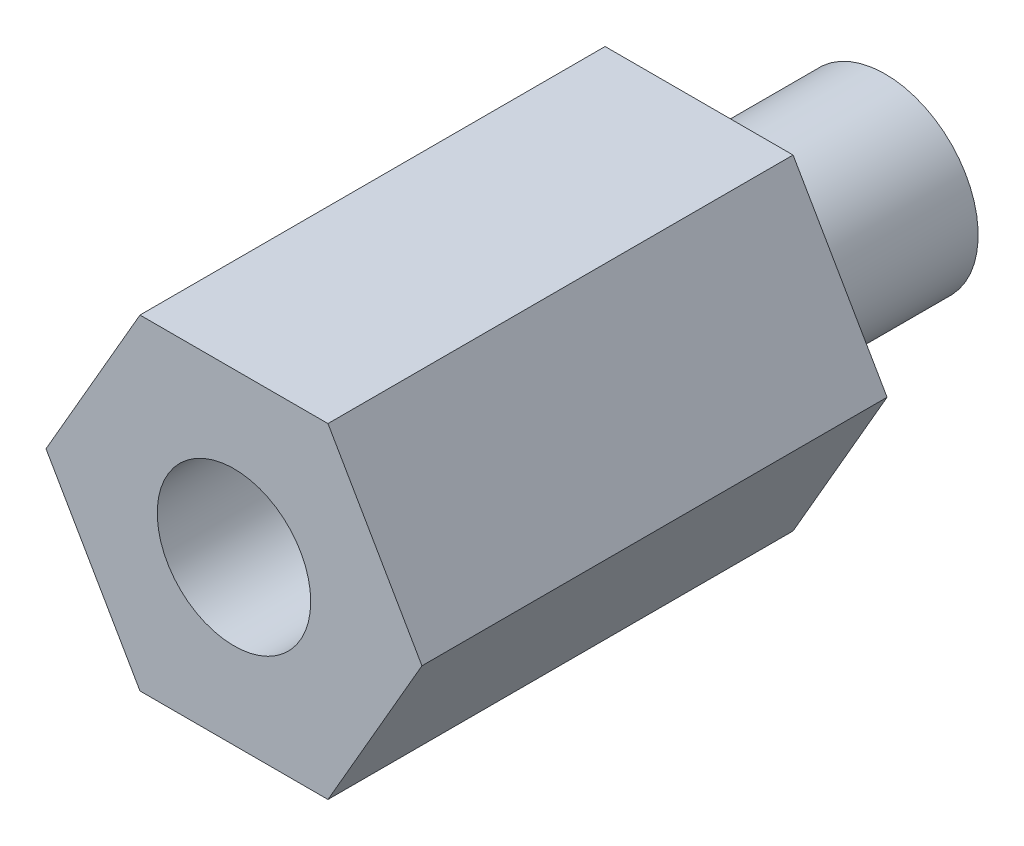
ISO-10303-21;
HEADER;
FILE_DESCRIPTION(('STEP AP214'),'2;1');
FILE_NAME('part.step','',(''),(''),'','','');
FILE_SCHEMA(('AUTOMOTIVE_DESIGN { 1 0 10303 214 1 1 1 1 }'));
ENDSEC;
DATA;
#1=APPLICATION_CONTEXT('core data for automotive mechanical design processes');
#2=APPLICATION_PROTOCOL_DEFINITION('international standard','automotive_design',2000,#1);
#3=PRODUCT_CONTEXT('',#1,'mechanical');
#4=PRODUCT('Part','Part','',(#3));
#5=PRODUCT_RELATED_PRODUCT_CATEGORY('part','',(#4));
#6=PRODUCT_DEFINITION_FORMATION('','',#4);
#7=PRODUCT_DEFINITION_CONTEXT('part definition',#1,'design');
#8=PRODUCT_DEFINITION('design','',#6,#7);
#9=PRODUCT_DEFINITION_SHAPE('','',#8);
#10=(LENGTH_UNIT() NAMED_UNIT(*) SI_UNIT(.MILLI.,.METRE.));
#11=(NAMED_UNIT(*) PLANE_ANGLE_UNIT() SI_UNIT($,.RADIAN.));
#12=(NAMED_UNIT(*) SI_UNIT($,.STERADIAN.) SOLID_ANGLE_UNIT());
#13=UNCERTAINTY_MEASURE_WITH_UNIT(LENGTH_MEASURE(1.E-05),#10,'distance_accuracy_value','');
#14=(GEOMETRIC_REPRESENTATION_CONTEXT(3) GLOBAL_UNCERTAINTY_ASSIGNED_CONTEXT((#13)) GLOBAL_UNIT_ASSIGNED_CONTEXT((#10,
#11,#12)) REPRESENTATION_CONTEXT('',''));
#15=CARTESIAN_POINT('',(0.,0.,0.));
#16=DIRECTION('',(0.,0.,1.));
#17=DIRECTION('',(1.,0.,0.));
#18=AXIS2_PLACEMENT_3D('',#15,#16,#17);
#19=CARTESIAN_POINT('',(2.02072594216369,3.5,10.));
#20=DIRECTION('',(0.,-1.,0.));
#21=DIRECTION('',(1.,0.,0.));
#22=AXIS2_PLACEMENT_3D('',#19,#20,#21);
#23=PLANE('',#22);
#24=DIRECTION('',(-1.,0.,0.));
#25=VECTOR('',#24,1.);
#26=CARTESIAN_POINT('',(2.02072594216369,3.5,0.));
#27=LINE('',#26,#25);
#28=CARTESIAN_POINT('',(2.02072594216369,3.5,0.));
#29=VERTEX_POINT('',#28);
#30=CARTESIAN_POINT('',(-2.02072594216369,3.5,0.));
#31=VERTEX_POINT('',#30);
#32=EDGE_CURVE('E123',#29,#31,#27,.T.);
#33=ORIENTED_EDGE('',*,*,#32,.T.);
#34=DIRECTION('',(0.,0.,-1.));
#35=VECTOR('',#34,1.);
#36=CARTESIAN_POINT('',(-2.02072594216369,3.5,10.));
#37=LINE('',#36,#35);
#38=CARTESIAN_POINT('',(-2.02072594216369,3.5,10.));
#39=VERTEX_POINT('',#38);
#40=EDGE_CURVE('E38',#39,#31,#37,.T.);
#41=ORIENTED_EDGE('',*,*,#40,.F.);
#42=DIRECTION('',(-1.,0.,0.));
#43=VECTOR('',#42,1.);
#44=CARTESIAN_POINT('',(2.02072594216369,3.5,10.));
#45=LINE('',#44,#43);
#46=CARTESIAN_POINT('',(2.02072594216369,3.5,10.));
#47=VERTEX_POINT('',#46);
#48=EDGE_CURVE('E134',#47,#39,#45,.T.);
#49=ORIENTED_EDGE('',*,*,#48,.F.);
#50=DIRECTION('',(0.,0.,-1.));
#51=VECTOR('',#50,1.);
#52=CARTESIAN_POINT('',(2.02072594216369,3.5,10.));
#53=LINE('',#52,#51);
#54=EDGE_CURVE('E119',#47,#29,#53,.T.);
#55=ORIENTED_EDGE('',*,*,#54,.T.);
#56=EDGE_LOOP('',(#33,#41,#49,#55));
#57=FACE_BOUND('',#56,.T.);
#58=ADVANCED_FACE('F35',(#57),#23,.F.);
#59=CARTESIAN_POINT('',(-2.02072594216369,3.5,10.));
#60=DIRECTION('',(0.866025403784439,-0.5,0.));
#61=DIRECTION('',(0.5,0.866025403784439,0.));
#62=AXIS2_PLACEMENT_3D('',#59,#60,#61);
#63=PLANE('',#62);
#64=DIRECTION('',(-0.5,-0.866025403784439,0.));
#65=VECTOR('',#64,1.);
#66=CARTESIAN_POINT('',(-2.02072594216369,3.5,0.));
#67=LINE('',#66,#65);
#68=CARTESIAN_POINT('',(-4.04145188432738,0.,0.));
#69=VERTEX_POINT('',#68);
#70=EDGE_CURVE('E126',#31,#69,#67,.T.);
#71=ORIENTED_EDGE('',*,*,#70,.T.);
#72=DIRECTION('',(0.,0.,-1.));
#73=VECTOR('',#72,1.);
#74=CARTESIAN_POINT('',(-4.04145188432738,0.,10.));
#75=LINE('',#74,#73);
#76=CARTESIAN_POINT('',(-4.04145188432738,0.,10.));
#77=VERTEX_POINT('',#76);
#78=EDGE_CURVE('E137',#77,#69,#75,.T.);
#79=ORIENTED_EDGE('',*,*,#78,.F.);
#80=DIRECTION('',(-0.5,-0.866025403784439,0.));
#81=VECTOR('',#80,1.);
#82=CARTESIAN_POINT('',(-2.02072594216369,3.5,10.));
#83=LINE('',#82,#81);
#84=EDGE_CURVE('E91',#39,#77,#83,.T.);
#85=ORIENTED_EDGE('',*,*,#84,.F.);
#86=ORIENTED_EDGE('',*,*,#40,.T.);
#87=EDGE_LOOP('',(#71,#79,#85,#86));
#88=FACE_BOUND('',#87,.T.);
#89=ADVANCED_FACE('F142',(#88),#63,.F.);
#90=CARTESIAN_POINT('',(-4.04145188432738,0.,10.));
#91=DIRECTION('',(0.866025403784438,0.5,0.));
#92=DIRECTION('',(-0.5,0.866025403784439,0.));
#93=AXIS2_PLACEMENT_3D('',#90,#91,#92);
#94=PLANE('',#93);
#95=DIRECTION('',(0.5,-0.866025403784439,0.));
#96=VECTOR('',#95,1.);
#97=CARTESIAN_POINT('',(-4.04145188432738,0.,0.));
#98=LINE('',#97,#96);
#99=CARTESIAN_POINT('',(-2.02072594216369,-3.5,0.));
#100=VERTEX_POINT('',#99);
#101=EDGE_CURVE('E129',#69,#100,#98,.T.);
#102=ORIENTED_EDGE('',*,*,#101,.T.);
#103=DIRECTION('',(0.,0.,-1.));
#104=VECTOR('',#103,1.);
#105=CARTESIAN_POINT('',(-2.02072594216369,-3.5,10.));
#106=LINE('',#105,#104);
#107=CARTESIAN_POINT('',(-2.02072594216369,-3.5,10.));
#108=VERTEX_POINT('',#107);
#109=EDGE_CURVE('E114',#108,#100,#106,.T.);
#110=ORIENTED_EDGE('',*,*,#109,.F.);
#111=DIRECTION('',(0.5,-0.866025403784439,0.));
#112=VECTOR('',#111,1.);
#113=CARTESIAN_POINT('',(-4.04145188432738,0.,10.));
#114=LINE('',#113,#112);
#115=EDGE_CURVE('E105',#77,#108,#114,.T.);
#116=ORIENTED_EDGE('',*,*,#115,.F.);
#117=ORIENTED_EDGE('',*,*,#78,.T.);
#118=EDGE_LOOP('',(#102,#110,#116,#117));
#119=FACE_BOUND('',#118,.T.);
#120=ADVANCED_FACE('F148',(#119),#94,.F.);
#121=CARTESIAN_POINT('',(-2.02072594216369,-3.5,10.));
#122=DIRECTION('',(0.,1.,0.));
#123=DIRECTION('',(-1.,0.,0.));
#124=AXIS2_PLACEMENT_3D('',#121,#122,#123);
#125=PLANE('',#124);
#126=DIRECTION('',(1.,0.,0.));
#127=VECTOR('',#126,1.);
#128=CARTESIAN_POINT('',(-2.02072594216369,-3.5,0.));
#129=LINE('',#128,#127);
#130=CARTESIAN_POINT('',(2.02072594216369,-3.5,0.));
#131=VERTEX_POINT('',#130);
#132=EDGE_CURVE('E113',#100,#131,#129,.T.);
#133=ORIENTED_EDGE('',*,*,#132,.T.);
#134=DIRECTION('',(0.,0.,-1.));
#135=VECTOR('',#134,1.);
#136=CARTESIAN_POINT('',(2.02072594216369,-3.5,10.));
#137=LINE('',#136,#135);
#138=CARTESIAN_POINT('',(2.02072594216369,-3.5,10.));
#139=VERTEX_POINT('',#138);
#140=EDGE_CURVE('E110',#139,#131,#137,.T.);
#141=ORIENTED_EDGE('',*,*,#140,.F.);
#142=DIRECTION('',(1.,0.,0.));
#143=VECTOR('',#142,1.);
#144=CARTESIAN_POINT('',(-2.02072594216369,-3.5,10.));
#145=LINE('',#144,#143);
#146=EDGE_CURVE('E99',#108,#139,#145,.T.);
#147=ORIENTED_EDGE('',*,*,#146,.F.);
#148=ORIENTED_EDGE('',*,*,#109,.T.);
#149=EDGE_LOOP('',(#133,#141,#147,#148));
#150=FACE_BOUND('',#149,.T.);
#151=ADVANCED_FACE('F111',(#150),#125,.F.);
#152=CARTESIAN_POINT('',(2.02072594216369,-3.5,10.));
#153=DIRECTION('',(-0.866025403784439,0.5,0.));
#154=DIRECTION('',(-0.5,-0.866025403784439,0.));
#155=AXIS2_PLACEMENT_3D('',#152,#153,#154);
#156=PLANE('',#155);
#157=DIRECTION('',(0.5,0.866025403784439,0.));
#158=VECTOR('',#157,1.);
#159=CARTESIAN_POINT('',(2.02072594216369,-3.5,0.));
#160=LINE('',#159,#158);
#161=CARTESIAN_POINT('',(4.04145188432738,0.,0.));
#162=VERTEX_POINT('',#161);
#163=EDGE_CURVE('E76',#131,#162,#160,.T.);
#164=ORIENTED_EDGE('',*,*,#163,.T.);
#165=DIRECTION('',(0.,0.,-1.));
#166=VECTOR('',#165,1.);
#167=CARTESIAN_POINT('',(4.04145188432738,0.,10.));
#168=LINE('',#167,#166);
#169=CARTESIAN_POINT('',(4.04145188432738,0.,10.));
#170=VERTEX_POINT('',#169);
#171=EDGE_CURVE('E115',#170,#162,#168,.T.);
#172=ORIENTED_EDGE('',*,*,#171,.F.);
#173=DIRECTION('',(0.5,0.866025403784439,0.));
#174=VECTOR('',#173,1.);
#175=CARTESIAN_POINT('',(2.02072594216369,-3.5,10.));
#176=LINE('',#175,#174);
#177=EDGE_CURVE('E103',#139,#170,#176,.T.);
#178=ORIENTED_EDGE('',*,*,#177,.F.);
#179=ORIENTED_EDGE('',*,*,#140,.T.);
#180=EDGE_LOOP('',(#164,#172,#178,#179));
#181=FACE_BOUND('',#180,.T.);
#182=ADVANCED_FACE('F117',(#181),#156,.F.);
#183=CARTESIAN_POINT('',(4.04145188432738,0.,10.));
#184=DIRECTION('',(-0.866025403784439,-0.5,0.));
#185=DIRECTION('',(0.5,-0.866025403784439,0.));
#186=AXIS2_PLACEMENT_3D('',#183,#184,#185);
#187=PLANE('',#186);
#188=DIRECTION('',(-0.5,0.866025403784438,0.));
#189=VECTOR('',#188,1.);
#190=CARTESIAN_POINT('',(4.04145188432738,0.,0.));
#191=LINE('',#190,#189);
#192=EDGE_CURVE('E82',#162,#29,#191,.T.);
#193=ORIENTED_EDGE('',*,*,#192,.T.);
#194=ORIENTED_EDGE('',*,*,#54,.F.);
#195=DIRECTION('',(-0.5,0.866025403784438,0.));
#196=VECTOR('',#195,1.);
#197=CARTESIAN_POINT('',(4.04145188432738,0.,10.));
#198=LINE('',#197,#196);
#199=EDGE_CURVE('E52',#170,#47,#198,.T.);
#200=ORIENTED_EDGE('',*,*,#199,.F.);
#201=ORIENTED_EDGE('',*,*,#171,.T.);
#202=EDGE_LOOP('',(#193,#194,#200,#201));
#203=FACE_BOUND('',#202,.T.);
#204=ADVANCED_FACE('F164',(#203),#187,.F.);
#205=CARTESIAN_POINT('',(0.,0.,10.));
#206=DIRECTION('',(0.,0.,1.));
#207=DIRECTION('',(1.,0.,0.));
#208=AXIS2_PLACEMENT_3D('',#205,#206,#207);
#209=PLANE('',#208);
#210=CARTESIAN_POINT('',(0.,0.,10.));
#211=DIRECTION('',(0.,0.,1.));
#212=DIRECTION('',(1.,0.,0.));
#213=AXIS2_PLACEMENT_3D('',#210,#211,#212);
#214=CIRCLE('',#213,1.65);
#215=CARTESIAN_POINT('',(1.65,0.,10.));
#216=VERTEX_POINT('',#215);
#217=EDGE_CURVE('E157',#216,#216,#214,.T.);
#218=ORIENTED_EDGE('',*,*,#217,.F.);
#219=EDGE_LOOP('',(#218));
#220=FACE_BOUND('',#219,.T.);
#221=ORIENTED_EDGE('',*,*,#48,.T.);
#222=ORIENTED_EDGE('',*,*,#84,.T.);
#223=ORIENTED_EDGE('',*,*,#115,.T.);
#224=ORIENTED_EDGE('',*,*,#146,.T.);
#225=ORIENTED_EDGE('',*,*,#177,.T.);
#226=ORIENTED_EDGE('',*,*,#199,.T.);
#227=EDGE_LOOP('',(#221,#222,#223,#224,#225,#226));
#228=FACE_BOUND('',#227,.T.);
#229=ADVANCED_FACE('F101',(#220,#228),#209,.T.);
#230=CARTESIAN_POINT('',(0.,0.,0.));
#231=DIRECTION('',(0.,0.,1.));
#232=DIRECTION('',(1.,0.,0.));
#233=AXIS2_PLACEMENT_3D('',#230,#231,#232);
#234=PLANE('',#233);
#235=CARTESIAN_POINT('',(0.,0.,0.));
#236=DIRECTION('',(0.,0.,-1.));
#237=DIRECTION('',(-1.,0.,0.));
#238=AXIS2_PLACEMENT_3D('',#235,#236,#237);
#239=CIRCLE('',#238,2.);
#240=CARTESIAN_POINT('',(-2.,0.,0.));
#241=VERTEX_POINT('',#240);
#242=EDGE_CURVE('E11',#241,#241,#239,.T.);
#243=ORIENTED_EDGE('',*,*,#242,.F.);
#244=EDGE_LOOP('',(#243));
#245=FACE_BOUND('',#244,.T.);
#246=ORIENTED_EDGE('',*,*,#32,.F.);
#247=ORIENTED_EDGE('',*,*,#192,.F.);
#248=ORIENTED_EDGE('',*,*,#163,.F.);
#249=ORIENTED_EDGE('',*,*,#132,.F.);
#250=ORIENTED_EDGE('',*,*,#101,.F.);
#251=ORIENTED_EDGE('',*,*,#70,.F.);
#252=EDGE_LOOP('',(#246,#247,#248,#249,#250,#251));
#253=FACE_BOUND('',#252,.T.);
#254=ADVANCED_FACE('F147',(#245,#253),#234,.F.);
#255=CARTESIAN_POINT('',(0.,0.,-4.));
#256=DIRECTION('',(0.,0.,1.));
#257=DIRECTION('',(1.,0.,0.));
#258=AXIS2_PLACEMENT_3D('',#255,#256,#257);
#259=CYLINDRICAL_SURFACE('',#258,2.);
#260=CARTESIAN_POINT('',(0.,0.,-4.));
#261=DIRECTION('',(0.,0.,-1.));
#262=DIRECTION('',(-1.,0.,0.));
#263=AXIS2_PLACEMENT_3D('',#260,#261,#262);
#264=CIRCLE('',#263,2.);
#265=CARTESIAN_POINT('',(-2.,0.,-4.));
#266=VERTEX_POINT('',#265);
#267=EDGE_CURVE('E127',#266,#266,#264,.T.);
#268=ORIENTED_EDGE('',*,*,#267,.F.);
#269=EDGE_LOOP('',(#268));
#270=FACE_BOUND('',#269,.T.);
#271=ORIENTED_EDGE('',*,*,#242,.T.);
#272=EDGE_LOOP('',(#271));
#273=FACE_BOUND('',#272,.T.);
#274=ADVANCED_FACE('F170',(#270,#273),#259,.T.);
#275=CARTESIAN_POINT('',(0.,0.,-4.));
#276=DIRECTION('',(0.,0.,-1.));
#277=DIRECTION('',(-1.,0.,0.));
#278=AXIS2_PLACEMENT_3D('',#275,#276,#277);
#279=PLANE('',#278);
#280=ORIENTED_EDGE('',*,*,#267,.T.);
#281=EDGE_LOOP('',(#280));
#282=FACE_BOUND('',#281,.T.);
#283=ADVANCED_FACE('F211',(#282),#279,.T.);
#284=CARTESIAN_POINT('',(0.,0.,2.));
#285=DIRECTION('',(0.,0.,1.));
#286=DIRECTION('',(1.,0.,0.));
#287=AXIS2_PLACEMENT_3D('',#284,#285,#286);
#288=CONICAL_SURFACE('',#287,1.65,1.02974425867665);
#289=CARTESIAN_POINT('',(0.,0.,1.00857997860452));
#290=VERTEX_POINT('',#289);
#291=VERTEX_LOOP('',#290);
#292=FACE_BOUND('',#291,.T.);
#293=CARTESIAN_POINT('',(0.,0.,2.));
#294=DIRECTION('',(0.,0.,1.));
#295=DIRECTION('',(1.,0.,0.));
#296=AXIS2_PLACEMENT_3D('',#293,#294,#295);
#297=CIRCLE('',#296,1.65);
#298=CARTESIAN_POINT('',(1.65,0.,2.));
#299=VERTEX_POINT('',#298);
#300=EDGE_CURVE('E154',#299,#299,#297,.T.);
#301=ORIENTED_EDGE('',*,*,#300,.T.);
#302=EDGE_LOOP('',(#301));
#303=FACE_BOUND('',#302,.T.);
#304=ADVANCED_FACE('F219',(#292,#303),#288,.F.);
#305=CARTESIAN_POINT('',(0.,0.,10.));
#306=DIRECTION('',(0.,0.,1.));
#307=DIRECTION('',(1.,0.,0.));
#308=AXIS2_PLACEMENT_3D('',#305,#306,#307);
#309=CYLINDRICAL_SURFACE('',#308,1.65);
#310=ORIENTED_EDGE('',*,*,#300,.F.);
#311=EDGE_LOOP('',(#310));
#312=FACE_BOUND('',#311,.T.);
#313=ORIENTED_EDGE('',*,*,#217,.T.);
#314=EDGE_LOOP('',(#313));
#315=FACE_BOUND('',#314,.T.);
#316=ADVANCED_FACE('F161',(#312,#315),#309,.F.);
#317=CLOSED_SHELL('',(#58,#89,#120,#151,#182,#204,#229,#254,#274,#283,#304,#316));
#318=MANIFOLD_SOLID_BREP('B2',#317);
#319=ADVANCED_BREP_SHAPE_REPRESENTATION('',(#18,#318),#14);
#320=SHAPE_DEFINITION_REPRESENTATION(#9,#319);
ENDSEC;
END-ISO-10303-21;
